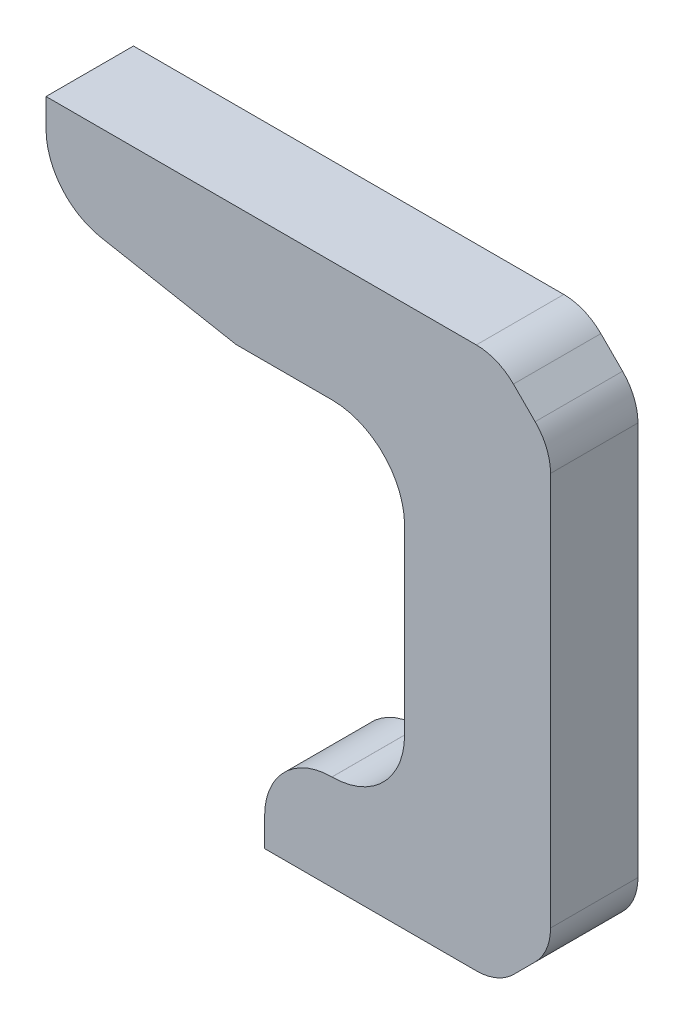
ISO-10303-21;
HEADER;
FILE_DESCRIPTION(('STEP AP214'),'2;1');
FILE_NAME('part.step','',(''),(''),'','','');
FILE_SCHEMA(('AUTOMOTIVE_DESIGN { 1 0 10303 214 1 1 1 1 }'));
ENDSEC;
DATA;
#1=APPLICATION_CONTEXT('core data for automotive mechanical design processes');
#2=APPLICATION_PROTOCOL_DEFINITION('international standard','automotive_design',2000,#1);
#3=PRODUCT_CONTEXT('',#1,'mechanical');
#4=PRODUCT('Part','Part','',(#3));
#5=PRODUCT_RELATED_PRODUCT_CATEGORY('part','',(#4));
#6=PRODUCT_DEFINITION_FORMATION('','',#4);
#7=PRODUCT_DEFINITION_CONTEXT('part definition',#1,'design');
#8=PRODUCT_DEFINITION('design','',#6,#7);
#9=PRODUCT_DEFINITION_SHAPE('','',#8);
#10=(LENGTH_UNIT() NAMED_UNIT(*) SI_UNIT(.MILLI.,.METRE.));
#11=(NAMED_UNIT(*) PLANE_ANGLE_UNIT() SI_UNIT($,.RADIAN.));
#12=(NAMED_UNIT(*) SI_UNIT($,.STERADIAN.) SOLID_ANGLE_UNIT());
#13=UNCERTAINTY_MEASURE_WITH_UNIT(LENGTH_MEASURE(1.E-05),#10,'distance_accuracy_value','');
#14=(GEOMETRIC_REPRESENTATION_CONTEXT(3) GLOBAL_UNCERTAINTY_ASSIGNED_CONTEXT((#13)) GLOBAL_UNIT_ASSIGNED_CONTEXT((#10,
#11,#12)) REPRESENTATION_CONTEXT('',''));
#15=CARTESIAN_POINT('',(0.,0.,0.));
#16=DIRECTION('',(0.,0.,1.));
#17=DIRECTION('',(1.,0.,0.));
#18=AXIS2_PLACEMENT_3D('',#15,#16,#17);
#19=CARTESIAN_POINT('',(-16.6933259094192,0.,10.));
#20=DIRECTION('',(1.,0.,0.));
#21=DIRECTION('',(0.,0.,-1.));
#22=AXIS2_PLACEMENT_3D('',#19,#20,#21);
#23=PLANE('',#22);
#24=DIRECTION('',(0.,0.,1.));
#25=VECTOR('',#24,1.);
#26=CARTESIAN_POINT('',(-16.6933259094192,21.,10.));
#27=LINE('',#26,#25);
#28=CARTESIAN_POINT('',(-16.6933259094192,21.,0.));
#29=VERTEX_POINT('',#28);
#30=CARTESIAN_POINT('',(-16.6933259094192,21.,8.));
#31=VERTEX_POINT('',#30);
#32=EDGE_CURVE('E204',#29,#31,#27,.T.);
#33=ORIENTED_EDGE('',*,*,#32,.F.);
#34=DIRECTION('',(0.,-1.,0.));
#35=VECTOR('',#34,1.);
#36=CARTESIAN_POINT('',(-16.6933259094192,0.,0.));
#37=LINE('',#36,#35);
#38=CARTESIAN_POINT('',(-16.6933259094192,19.25,0.));
#39=VERTEX_POINT('',#38);
#40=EDGE_CURVE('E215',#29,#39,#37,.T.);
#41=ORIENTED_EDGE('',*,*,#40,.T.);
#42=DIRECTION('',(0.,0.,-1.));
#43=VECTOR('',#42,1.);
#44=CARTESIAN_POINT('',(-16.6933259094192,19.25,10.));
#45=LINE('',#44,#43);
#46=CARTESIAN_POINT('',(-16.6933259094192,19.25,10.));
#47=VERTEX_POINT('',#46);
#48=EDGE_CURVE('E210',#47,#39,#45,.T.);
#49=ORIENTED_EDGE('',*,*,#48,.F.);
#50=DIRECTION('',(0.,-1.,0.));
#51=VECTOR('',#50,1.);
#52=CARTESIAN_POINT('',(-16.6933259094192,0.,10.));
#53=LINE('',#52,#51);
#54=CARTESIAN_POINT('',(-16.6933259094192,40.,10.));
#55=VERTEX_POINT('',#54);
#56=EDGE_CURVE('E274',#55,#47,#53,.T.);
#57=ORIENTED_EDGE('',*,*,#56,.F.);
#58=DIRECTION('',(0.,0.,-1.));
#59=VECTOR('',#58,1.);
#60=CARTESIAN_POINT('',(-16.6933259094192,40.,10.));
#61=LINE('',#60,#59);
#62=CARTESIAN_POINT('',(-16.6933259094192,40.,8.));
#63=VERTEX_POINT('',#62);
#64=EDGE_CURVE('E275',#55,#63,#61,.T.);
#65=ORIENTED_EDGE('',*,*,#64,.T.);
#66=DIRECTION('',(0.,-1.,0.));
#67=VECTOR('',#66,1.);
#68=CARTESIAN_POINT('',(-16.6933259094192,0.,8.));
#69=LINE('',#68,#67);
#70=EDGE_CURVE('E218',#63,#31,#69,.T.);
#71=ORIENTED_EDGE('',*,*,#70,.T.);
#72=EDGE_LOOP('',(#33,#41,#49,#57,#65,#71));
#73=FACE_BOUND('',#72,.T.);
#74=ADVANCED_FACE('F35',(#73),#23,.F.);
#75=CARTESIAN_POINT('',(-24.9933259094192,40.,10.));
#76=DIRECTION('',(0.,0.,-1.));
#77=DIRECTION('',(-1.,0.,0.));
#78=AXIS2_PLACEMENT_3D('',#75,#76,#77);
#79=CYLINDRICAL_SURFACE('',#78,8.3);
#80=CARTESIAN_POINT('',(-24.9933259094192,40.,0.));
#81=DIRECTION('',(0.,0.,1.));
#82=DIRECTION('',(1.,0.,0.));
#83=AXIS2_PLACEMENT_3D('',#80,#81,#82);
#84=CIRCLE('',#83,8.3);
#85=CARTESIAN_POINT('',(-16.7537870873733,41.,0.));
#86=VERTEX_POINT('',#85);
#87=CARTESIAN_POINT('',(-24.9933259094192,48.3,0.));
#88=VERTEX_POINT('',#87);
#89=EDGE_CURVE('E272',#86,#88,#84,.T.);
#90=ORIENTED_EDGE('',*,*,#89,.F.);
#91=DIRECTION('',(0.,0.,-1.));
#92=VECTOR('',#91,1.);
#93=CARTESIAN_POINT('',(-16.7537870873733,41.,10.));
#94=LINE('',#93,#92);
#95=CARTESIAN_POINT('',(-16.7537870873733,41.,8.));
#96=VERTEX_POINT('',#95);
#97=EDGE_CURVE('E219',#86,#96,#94,.F.);
#98=ORIENTED_EDGE('',*,*,#97,.T.);
#99=CARTESIAN_POINT('',(-24.9933259094192,40.,8.));
#100=DIRECTION('',(0.,0.,1.));
#101=DIRECTION('',(1.,0.,0.));
#102=AXIS2_PLACEMENT_3D('',#99,#100,#101);
#103=CIRCLE('',#102,8.3);
#104=EDGE_CURVE('E209',#63,#96,#103,.T.);
#105=ORIENTED_EDGE('',*,*,#104,.F.);
#106=ORIENTED_EDGE('',*,*,#64,.F.);
#107=CARTESIAN_POINT('',(-24.9933259094192,40.,10.));
#108=DIRECTION('',(0.,0.,1.));
#109=DIRECTION('',(1.,0.,0.));
#110=AXIS2_PLACEMENT_3D('',#107,#108,#109);
#111=CIRCLE('',#110,8.3);
#112=CARTESIAN_POINT('',(-24.9933259094192,48.3,10.));
#113=VERTEX_POINT('',#112);
#114=EDGE_CURVE('E231',#55,#113,#111,.T.);
#115=ORIENTED_EDGE('',*,*,#114,.T.);
#116=DIRECTION('',(0.,0.,-1.));
#117=VECTOR('',#116,1.);
#118=CARTESIAN_POINT('',(-24.9933259094192,48.3,10.));
#119=LINE('',#118,#117);
#120=EDGE_CURVE('E277',#113,#88,#119,.T.);
#121=ORIENTED_EDGE('',*,*,#120,.T.);
#122=EDGE_LOOP('',(#90,#98,#105,#106,#115,#121));
#123=FACE_BOUND('',#122,.T.);
#124=ADVANCED_FACE('F403',(#123),#79,.F.);
#125=CARTESIAN_POINT('',(0.,0.,0.));
#126=DIRECTION('',(0.,0.,1.));
#127=DIRECTION('',(1.,0.,0.));
#128=AXIS2_PLACEMENT_3D('',#125,#126,#127);
#129=PLANE('',#128);
#130=DIRECTION('',(0.,1.,0.));
#131=VECTOR('',#130,1.);
#132=CARTESIAN_POINT('',(-12.1933259094191,0.,0.));
#133=LINE('',#132,#131);
#134=CARTESIAN_POINT('',(-12.1933259094191,24.,0.));
#135=VERTEX_POINT('',#134);
#136=CARTESIAN_POINT('',(-12.1933259094191,38.,0.));
#137=VERTEX_POINT('',#136);
#138=EDGE_CURVE('E336',#135,#137,#133,.T.);
#139=ORIENTED_EDGE('',*,*,#138,.T.);
#140=CARTESIAN_POINT('',(-15.1933259094191,38.,0.));
#141=DIRECTION('',(0.,0.,1.));
#142=DIRECTION('',(1.,0.,0.));
#143=AXIS2_PLACEMENT_3D('',#140,#141,#142);
#144=CIRCLE('',#143,3.);
#145=CARTESIAN_POINT('',(-15.1933259094191,41.,0.));
#146=VERTEX_POINT('',#145);
#147=EDGE_CURVE('E11',#137,#146,#144,.T.);
#148=ORIENTED_EDGE('',*,*,#147,.T.);
#149=DIRECTION('',(-1.,0.,0.));
#150=VECTOR('',#149,1.);
#151=CARTESIAN_POINT('',(0.,41.,0.));
#152=LINE('',#151,#150);
#153=EDGE_CURVE('E344',#146,#86,#152,.T.);
#154=ORIENTED_EDGE('',*,*,#153,.T.);
#155=ORIENTED_EDGE('',*,*,#89,.T.);
#156=DIRECTION('',(1.,0.,0.));
#157=VECTOR('',#156,1.);
#158=CARTESIAN_POINT('',(0.,48.3,0.));
#159=LINE('',#158,#157);
#160=CARTESIAN_POINT('',(-35.9722540963591,48.3,0.));
#161=VERTEX_POINT('',#160);
#162=EDGE_CURVE('E269',#161,#88,#159,.T.);
#163=ORIENTED_EDGE('',*,*,#162,.F.);
#164=DIRECTION('',(0.983037643124041,-0.183403904541674,0.));
#165=VECTOR('',#164,1.);
#166=CARTESIAN_POINT('',(7.49815067102066,40.1897897531087,0.));
#167=LINE('',#166,#165);
#168=CARTESIAN_POINT('',(-51.4122100649709,51.1806101479449,0.));
#169=VERTEX_POINT('',#168);
#170=EDGE_CURVE('E267',#169,#161,#167,.T.);
#171=ORIENTED_EDGE('',*,*,#170,.F.);
#172=CARTESIAN_POINT('',(-50.,58.75,0.));
#173=DIRECTION('',(0.,0.,1.));
#174=DIRECTION('',(1.,0.,0.));
#175=AXIS2_PLACEMENT_3D('',#172,#173,#174);
#176=CIRCLE('',#175,7.69999999999999);
#177=CARTESIAN_POINT('',(-57.7,58.75,0.));
#178=VERTEX_POINT('',#177);
#179=EDGE_CURVE('E265',#178,#169,#176,.T.);
#180=ORIENTED_EDGE('',*,*,#179,.F.);
#181=DIRECTION('',(0.,-1.,0.));
#182=VECTOR('',#181,1.);
#183=CARTESIAN_POINT('',(-57.7,0.,0.));
#184=LINE('',#183,#182);
#185=CARTESIAN_POINT('',(-57.7,62.,0.));
#186=VERTEX_POINT('',#185);
#187=EDGE_CURVE('E263',#186,#178,#184,.T.);
#188=ORIENTED_EDGE('',*,*,#187,.F.);
#189=DIRECTION('',(1.,0.,0.));
#190=VECTOR('',#189,1.);
#191=CARTESIAN_POINT('',(0.,62.,0.));
#192=LINE('',#191,#190);
#193=CARTESIAN_POINT('',(-8.48528137423859,62.,0.));
#194=VERTEX_POINT('',#193);
#195=EDGE_CURVE('E260',#186,#194,#192,.T.);
#196=ORIENTED_EDGE('',*,*,#195,.T.);
#197=CARTESIAN_POINT('',(-8.48528137423857,56.,0.));
#198=DIRECTION('',(0.,0.,1.));
#199=DIRECTION('',(1.,0.,0.));
#200=AXIS2_PLACEMENT_3D('',#197,#198,#199);
#201=CIRCLE('',#200,6.);
#202=CARTESIAN_POINT('',(-4.24264068711927,60.2426406871192,0.));
#203=VERTEX_POINT('',#202);
#204=EDGE_CURVE('E257',#203,#194,#201,.T.);
#205=ORIENTED_EDGE('',*,*,#204,.F.);
#206=DIRECTION('',(-0.707106781186548,0.707106781186547,0.));
#207=VECTOR('',#206,1.);
#208=CARTESIAN_POINT('',(28.,28.,0.));
#209=LINE('',#208,#207);
#210=CARTESIAN_POINT('',(-1.75735931288074,57.7573593128807,0.));
#211=VERTEX_POINT('',#210);
#212=EDGE_CURVE('E255',#211,#203,#209,.T.);
#213=ORIENTED_EDGE('',*,*,#212,.F.);
#214=CARTESIAN_POINT('',(-6.,53.5147186257614,0.));
#215=DIRECTION('',(0.,0.,1.));
#216=DIRECTION('',(1.,0.,0.));
#217=AXIS2_PLACEMENT_3D('',#214,#215,#216);
#218=CIRCLE('',#217,6.);
#219=CARTESIAN_POINT('',(0.,53.5147186257614,0.));
#220=VERTEX_POINT('',#219);
#221=EDGE_CURVE('E252',#211,#220,#218,.F.);
#222=ORIENTED_EDGE('',*,*,#221,.T.);
#223=DIRECTION('',(0.,1.,0.));
#224=VECTOR('',#223,1.);
#225=CARTESIAN_POINT('',(0.,0.,0.));
#226=LINE('',#225,#224);
#227=CARTESIAN_POINT('',(0.,8.4852813742386,0.));
#228=VERTEX_POINT('',#227);
#229=EDGE_CURVE('E249',#228,#220,#226,.T.);
#230=ORIENTED_EDGE('',*,*,#229,.F.);
#231=CARTESIAN_POINT('',(-6.,8.48528137423857,0.));
#232=DIRECTION('',(0.,0.,1.));
#233=DIRECTION('',(1.,0.,0.));
#234=AXIS2_PLACEMENT_3D('',#231,#232,#233);
#235=CIRCLE('',#234,6.);
#236=CARTESIAN_POINT('',(-1.75735931288073,4.24264068711927,0.));
#237=VERTEX_POINT('',#236);
#238=EDGE_CURVE('E247',#237,#228,#235,.T.);
#239=ORIENTED_EDGE('',*,*,#238,.F.);
#240=DIRECTION('',(0.707106781186548,0.707106781186548,0.));
#241=VECTOR('',#240,1.);
#242=CARTESIAN_POINT('',(-3.,3.,0.));
#243=LINE('',#242,#241);
#244=CARTESIAN_POINT('',(-4.24264068711927,1.75735931288073,0.));
#245=VERTEX_POINT('',#244);
#246=EDGE_CURVE('E245',#245,#237,#243,.T.);
#247=ORIENTED_EDGE('',*,*,#246,.F.);
#248=CARTESIAN_POINT('',(-8.48528137423857,6.,0.));
#249=DIRECTION('',(0.,0.,1.));
#250=DIRECTION('',(1.,0.,0.));
#251=AXIS2_PLACEMENT_3D('',#248,#249,#250);
#252=CIRCLE('',#251,6.);
#253=CARTESIAN_POINT('',(-8.4852813742386,0.,0.));
#254=VERTEX_POINT('',#253);
#255=EDGE_CURVE('E242',#245,#254,#252,.F.);
#256=ORIENTED_EDGE('',*,*,#255,.T.);
#257=DIRECTION('',(1.,0.,0.));
#258=VECTOR('',#257,1.);
#259=CARTESIAN_POINT('',(0.,0.,0.));
#260=LINE('',#259,#258);
#261=CARTESIAN_POINT('',(-32.7,0.,0.));
#262=VERTEX_POINT('',#261);
#263=EDGE_CURVE('E239',#262,#254,#260,.T.);
#264=ORIENTED_EDGE('',*,*,#263,.F.);
#265=DIRECTION('',(0.,-1.,0.));
#266=VECTOR('',#265,1.);
#267=CARTESIAN_POINT('',(-32.7,0.,0.));
#268=LINE('',#267,#266);
#269=CARTESIAN_POINT('',(-32.7,3.25,0.));
#270=VERTEX_POINT('',#269);
#271=EDGE_CURVE('E237',#270,#262,#268,.T.);
#272=ORIENTED_EDGE('',*,*,#271,.F.);
#273=CARTESIAN_POINT('',(-25.,3.25,0.));
#274=DIRECTION('',(0.,0.,1.));
#275=DIRECTION('',(1.,0.,0.));
#276=AXIS2_PLACEMENT_3D('',#273,#274,#275);
#277=CIRCLE('',#276,7.7);
#278=CARTESIAN_POINT('',(-25.,10.95,0.));
#279=VERTEX_POINT('',#278);
#280=EDGE_CURVE('E235',#279,#270,#277,.T.);
#281=ORIENTED_EDGE('',*,*,#280,.F.);
#282=DIRECTION('',(-1.,2.59919078856519E-13,0.));
#283=VECTOR('',#282,1.);
#284=CARTESIAN_POINT('',(2.8461139134772E-12,10.9499999999935,0.));
#285=LINE('',#284,#283);
#286=CARTESIAN_POINT('',(-24.9933259094192,10.95,0.));
#287=VERTEX_POINT('',#286);
#288=EDGE_CURVE('E227',#287,#279,#285,.T.);
#289=ORIENTED_EDGE('',*,*,#288,.F.);
#290=CARTESIAN_POINT('',(-24.9933259094192,19.25,0.));
#291=DIRECTION('',(0.,0.,1.));
#292=DIRECTION('',(1.,0.,0.));
#293=AXIS2_PLACEMENT_3D('',#290,#291,#292);
#294=CIRCLE('',#293,8.3);
#295=EDGE_CURVE('E224',#39,#287,#294,.F.);
#296=ORIENTED_EDGE('',*,*,#295,.F.);
#297=ORIENTED_EDGE('',*,*,#40,.F.);
#298=DIRECTION('',(-1.,0.,0.));
#299=VECTOR('',#298,1.);
#300=CARTESIAN_POINT('',(0.,21.,0.));
#301=LINE('',#300,#299);
#302=CARTESIAN_POINT('',(-15.1933259094191,21.,0.));
#303=VERTEX_POINT('',#302);
#304=EDGE_CURVE('E200',#303,#29,#301,.T.);
#305=ORIENTED_EDGE('',*,*,#304,.F.);
#306=CARTESIAN_POINT('',(-15.1933259094191,24.,0.));
#307=DIRECTION('',(0.,0.,1.));
#308=DIRECTION('',(1.,0.,0.));
#309=AXIS2_PLACEMENT_3D('',#306,#307,#308);
#310=CIRCLE('',#309,3.);
#311=EDGE_CURVE('E43',#303,#135,#310,.T.);
#312=ORIENTED_EDGE('',*,*,#311,.T.);
#313=EDGE_LOOP('',(#139,#148,#154,#155,#163,#171,#180,#188,#196,#205,#213,#222,#230,#239,#247,
#256,#264,#272,#281,#289,#296,#297,#305,#312));
#314=FACE_BOUND('',#313,.T.);
#315=ADVANCED_FACE('F222',(#314),#129,.F.);
#316=CARTESIAN_POINT('',(-24.9933259094192,19.25,10.));
#317=DIRECTION('',(0.,0.,-1.));
#318=DIRECTION('',(-1.,0.,0.));
#319=AXIS2_PLACEMENT_3D('',#316,#317,#318);
#320=CYLINDRICAL_SURFACE('',#319,8.3);
#321=ORIENTED_EDGE('',*,*,#295,.T.);
#322=DIRECTION('',(0.,0.,-1.));
#323=VECTOR('',#322,1.);
#324=CARTESIAN_POINT('',(-24.9933259094192,10.95,10.));
#325=LINE('',#324,#323);
#326=CARTESIAN_POINT('',(-24.9933259094192,10.95,10.));
#327=VERTEX_POINT('',#326);
#328=EDGE_CURVE('E319',#327,#287,#325,.T.);
#329=ORIENTED_EDGE('',*,*,#328,.F.);
#330=CARTESIAN_POINT('',(-24.9933259094192,19.25,10.));
#331=DIRECTION('',(0.,0.,1.));
#332=DIRECTION('',(1.,0.,0.));
#333=AXIS2_PLACEMENT_3D('',#330,#331,#332);
#334=CIRCLE('',#333,8.3);
#335=EDGE_CURVE('E361',#47,#327,#334,.F.);
#336=ORIENTED_EDGE('',*,*,#335,.F.);
#337=ORIENTED_EDGE('',*,*,#48,.T.);
#338=EDGE_LOOP('',(#321,#329,#336,#337));
#339=FACE_BOUND('',#338,.T.);
#340=ADVANCED_FACE('F409',(#339),#320,.F.);
#341=CARTESIAN_POINT('',(2.8461139134772E-12,10.9499999999935,10.));
#342=DIRECTION('',(-2.59919078856519E-13,-1.,0.));
#343=DIRECTION('',(1.,-2.59919078856519E-13,0.));
#344=AXIS2_PLACEMENT_3D('',#341,#342,#343);
#345=PLANE('',#344);
#346=ORIENTED_EDGE('',*,*,#288,.T.);
#347=DIRECTION('',(0.,0.,-1.));
#348=VECTOR('',#347,1.);
#349=CARTESIAN_POINT('',(-25.,10.95,10.));
#350=LINE('',#349,#348);
#351=CARTESIAN_POINT('',(-25.,10.95,10.));
#352=VERTEX_POINT('',#351);
#353=EDGE_CURVE('E316',#352,#279,#350,.T.);
#354=ORIENTED_EDGE('',*,*,#353,.F.);
#355=DIRECTION('',(-1.,2.59919078856519E-13,0.));
#356=VECTOR('',#355,1.);
#357=CARTESIAN_POINT('',(2.8461139134772E-12,10.9499999999935,10.));
#358=LINE('',#357,#356);
#359=EDGE_CURVE('E363',#327,#352,#358,.T.);
#360=ORIENTED_EDGE('',*,*,#359,.F.);
#361=ORIENTED_EDGE('',*,*,#328,.T.);
#362=EDGE_LOOP('',(#346,#354,#360,#361));
#363=FACE_BOUND('',#362,.T.);
#364=ADVANCED_FACE('F413',(#363),#345,.F.);
#365=CARTESIAN_POINT('',(-25.,3.25,10.));
#366=DIRECTION('',(0.,0.,-1.));
#367=DIRECTION('',(-1.,0.,0.));
#368=AXIS2_PLACEMENT_3D('',#365,#366,#367);
#369=CYLINDRICAL_SURFACE('',#368,7.7);
#370=ORIENTED_EDGE('',*,*,#280,.T.);
#371=DIRECTION('',(0.,0.,-1.));
#372=VECTOR('',#371,1.);
#373=CARTESIAN_POINT('',(-32.7,3.25,10.));
#374=LINE('',#373,#372);
#375=CARTESIAN_POINT('',(-32.7,3.25,10.));
#376=VERTEX_POINT('',#375);
#377=EDGE_CURVE('E313',#376,#270,#374,.T.);
#378=ORIENTED_EDGE('',*,*,#377,.F.);
#379=CARTESIAN_POINT('',(-25.,3.25,10.));
#380=DIRECTION('',(0.,0.,1.));
#381=DIRECTION('',(1.,0.,0.));
#382=AXIS2_PLACEMENT_3D('',#379,#380,#381);
#383=CIRCLE('',#382,7.7);
#384=EDGE_CURVE('E365',#352,#376,#383,.T.);
#385=ORIENTED_EDGE('',*,*,#384,.F.);
#386=ORIENTED_EDGE('',*,*,#353,.T.);
#387=EDGE_LOOP('',(#370,#378,#385,#386));
#388=FACE_BOUND('',#387,.T.);
#389=ADVANCED_FACE('F419',(#388),#369,.T.);
#390=CARTESIAN_POINT('',(-32.7,0.,10.));
#391=DIRECTION('',(1.,0.,0.));
#392=DIRECTION('',(0.,0.,-1.));
#393=AXIS2_PLACEMENT_3D('',#390,#391,#392);
#394=PLANE('',#393);
#395=ORIENTED_EDGE('',*,*,#271,.T.);
#396=DIRECTION('',(0.,0.,-1.));
#397=VECTOR('',#396,1.);
#398=CARTESIAN_POINT('',(-32.7,0.,10.));
#399=LINE('',#398,#397);
#400=CARTESIAN_POINT('',(-32.7,0.,10.));
#401=VERTEX_POINT('',#400);
#402=EDGE_CURVE('E310',#401,#262,#399,.T.);
#403=ORIENTED_EDGE('',*,*,#402,.F.);
#404=DIRECTION('',(0.,-1.,0.));
#405=VECTOR('',#404,1.);
#406=CARTESIAN_POINT('',(-32.7,0.,10.));
#407=LINE('',#406,#405);
#408=EDGE_CURVE('E367',#376,#401,#407,.T.);
#409=ORIENTED_EDGE('',*,*,#408,.F.);
#410=ORIENTED_EDGE('',*,*,#377,.T.);
#411=EDGE_LOOP('',(#395,#403,#409,#410));
#412=FACE_BOUND('',#411,.T.);
#413=ADVANCED_FACE('F423',(#412),#394,.F.);
#414=CARTESIAN_POINT('',(0.,0.,10.));
#415=DIRECTION('',(0.,1.,0.));
#416=DIRECTION('',(0.,0.,1.));
#417=AXIS2_PLACEMENT_3D('',#414,#415,#416);
#418=PLANE('',#417);
#419=ORIENTED_EDGE('',*,*,#263,.T.);
#420=DIRECTION('',(0.,0.,-1.));
#421=VECTOR('',#420,1.);
#422=CARTESIAN_POINT('',(-8.4852813742386,0.,10.));
#423=LINE('',#422,#421);
#424=CARTESIAN_POINT('',(-8.4852813742386,0.,10.));
#425=VERTEX_POINT('',#424);
#426=EDGE_CURVE('E308',#425,#254,#423,.T.);
#427=ORIENTED_EDGE('',*,*,#426,.F.);
#428=DIRECTION('',(1.,0.,0.));
#429=VECTOR('',#428,1.);
#430=CARTESIAN_POINT('',(0.,0.,10.));
#431=LINE('',#430,#429);
#432=EDGE_CURVE('E369',#401,#425,#431,.T.);
#433=ORIENTED_EDGE('',*,*,#432,.F.);
#434=ORIENTED_EDGE('',*,*,#402,.T.);
#435=EDGE_LOOP('',(#419,#427,#433,#434));
#436=FACE_BOUND('',#435,.T.);
#437=ADVANCED_FACE('F428',(#436),#418,.F.);
#438=CARTESIAN_POINT('',(-8.48528137423857,6.,10.));
#439=DIRECTION('',(0.,0.,-1.));
#440=DIRECTION('',(-1.,0.,0.));
#441=AXIS2_PLACEMENT_3D('',#438,#439,#440);
#442=CYLINDRICAL_SURFACE('',#441,6.);
#443=ORIENTED_EDGE('',*,*,#255,.F.);
#444=DIRECTION('',(0.,0.,-1.));
#445=VECTOR('',#444,1.);
#446=CARTESIAN_POINT('',(-4.24264068711927,1.75735931288073,10.));
#447=LINE('',#446,#445);
#448=CARTESIAN_POINT('',(-4.24264068711927,1.75735931288073,10.));
#449=VERTEX_POINT('',#448);
#450=EDGE_CURVE('E306',#449,#245,#447,.T.);
#451=ORIENTED_EDGE('',*,*,#450,.F.);
#452=CARTESIAN_POINT('',(-8.48528137423857,6.,10.));
#453=DIRECTION('',(0.,0.,1.));
#454=DIRECTION('',(1.,0.,0.));
#455=AXIS2_PLACEMENT_3D('',#452,#453,#454);
#456=CIRCLE('',#455,6.);
#457=EDGE_CURVE('E371',#449,#425,#456,.F.);
#458=ORIENTED_EDGE('',*,*,#457,.T.);
#459=ORIENTED_EDGE('',*,*,#426,.T.);
#460=EDGE_LOOP('',(#443,#451,#458,#459));
#461=FACE_BOUND('',#460,.T.);
#462=ADVANCED_FACE('F434',(#461),#442,.T.);
#463=CARTESIAN_POINT('',(-3.,3.,10.));
#464=DIRECTION('',(-0.707106781186548,0.707106781186548,0.));
#465=DIRECTION('',(-0.707106781186548,-0.707106781186548,0.));
#466=AXIS2_PLACEMENT_3D('',#463,#464,#465);
#467=PLANE('',#466);
#468=ORIENTED_EDGE('',*,*,#246,.T.);
#469=DIRECTION('',(0.,0.,-1.));
#470=VECTOR('',#469,1.);
#471=CARTESIAN_POINT('',(-1.75735931288073,4.24264068711927,10.));
#472=LINE('',#471,#470);
#473=CARTESIAN_POINT('',(-1.75735931288073,4.24264068711927,10.));
#474=VERTEX_POINT('',#473);
#475=EDGE_CURVE('E303',#474,#237,#472,.T.);
#476=ORIENTED_EDGE('',*,*,#475,.F.);
#477=DIRECTION('',(0.707106781186548,0.707106781186548,0.));
#478=VECTOR('',#477,1.);
#479=CARTESIAN_POINT('',(-3.,3.,10.));
#480=LINE('',#479,#478);
#481=EDGE_CURVE('E374',#449,#474,#480,.T.);
#482=ORIENTED_EDGE('',*,*,#481,.F.);
#483=ORIENTED_EDGE('',*,*,#450,.T.);
#484=EDGE_LOOP('',(#468,#476,#482,#483));
#485=FACE_BOUND('',#484,.T.);
#486=ADVANCED_FACE('F437',(#485),#467,.F.);
#487=CARTESIAN_POINT('',(-6.,8.48528137423857,10.));
#488=DIRECTION('',(0.,0.,-1.));
#489=DIRECTION('',(-1.,0.,0.));
#490=AXIS2_PLACEMENT_3D('',#487,#488,#489);
#491=CYLINDRICAL_SURFACE('',#490,6.);
#492=ORIENTED_EDGE('',*,*,#238,.T.);
#493=DIRECTION('',(0.,0.,-1.));
#494=VECTOR('',#493,1.);
#495=CARTESIAN_POINT('',(0.,8.4852813742386,10.));
#496=LINE('',#495,#494);
#497=CARTESIAN_POINT('',(0.,8.4852813742386,10.));
#498=VERTEX_POINT('',#497);
#499=EDGE_CURVE('E300',#498,#228,#496,.T.);
#500=ORIENTED_EDGE('',*,*,#499,.F.);
#501=CARTESIAN_POINT('',(-6.,8.48528137423857,10.));
#502=DIRECTION('',(0.,0.,1.));
#503=DIRECTION('',(1.,0.,0.));
#504=AXIS2_PLACEMENT_3D('',#501,#502,#503);
#505=CIRCLE('',#504,6.);
#506=EDGE_CURVE('E376',#474,#498,#505,.T.);
#507=ORIENTED_EDGE('',*,*,#506,.F.);
#508=ORIENTED_EDGE('',*,*,#475,.T.);
#509=EDGE_LOOP('',(#492,#500,#507,#508));
#510=FACE_BOUND('',#509,.T.);
#511=ADVANCED_FACE('F442',(#510),#491,.T.);
#512=CARTESIAN_POINT('',(0.,0.,10.));
#513=DIRECTION('',(-1.,0.,0.));
#514=DIRECTION('',(0.,0.,1.));
#515=AXIS2_PLACEMENT_3D('',#512,#513,#514);
#516=PLANE('',#515);
#517=ORIENTED_EDGE('',*,*,#229,.T.);
#518=DIRECTION('',(0.,0.,-1.));
#519=VECTOR('',#518,1.);
#520=CARTESIAN_POINT('',(0.,53.5147186257614,10.));
#521=LINE('',#520,#519);
#522=CARTESIAN_POINT('',(0.,53.5147186257614,10.));
#523=VERTEX_POINT('',#522);
#524=EDGE_CURVE('E298',#523,#220,#521,.T.);
#525=ORIENTED_EDGE('',*,*,#524,.F.);
#526=DIRECTION('',(0.,1.,0.));
#527=VECTOR('',#526,1.);
#528=CARTESIAN_POINT('',(0.,0.,10.));
#529=LINE('',#528,#527);
#530=EDGE_CURVE('E378',#498,#523,#529,.T.);
#531=ORIENTED_EDGE('',*,*,#530,.F.);
#532=ORIENTED_EDGE('',*,*,#499,.T.);
#533=EDGE_LOOP('',(#517,#525,#531,#532));
#534=FACE_BOUND('',#533,.T.);
#535=ADVANCED_FACE('F447',(#534),#516,.F.);
#536=CARTESIAN_POINT('',(-6.,53.5147186257614,10.));
#537=DIRECTION('',(0.,0.,-1.));
#538=DIRECTION('',(-1.,0.,0.));
#539=AXIS2_PLACEMENT_3D('',#536,#537,#538);
#540=CYLINDRICAL_SURFACE('',#539,6.);
#541=ORIENTED_EDGE('',*,*,#221,.F.);
#542=DIRECTION('',(0.,0.,-1.));
#543=VECTOR('',#542,1.);
#544=CARTESIAN_POINT('',(-1.75735931288074,57.7573593128807,10.));
#545=LINE('',#544,#543);
#546=CARTESIAN_POINT('',(-1.75735931288074,57.7573593128807,10.));
#547=VERTEX_POINT('',#546);
#548=EDGE_CURVE('E296',#547,#211,#545,.T.);
#549=ORIENTED_EDGE('',*,*,#548,.F.);
#550=CARTESIAN_POINT('',(-6.,53.5147186257614,10.));
#551=DIRECTION('',(0.,0.,1.));
#552=DIRECTION('',(1.,0.,0.));
#553=AXIS2_PLACEMENT_3D('',#550,#551,#552);
#554=CIRCLE('',#553,6.);
#555=EDGE_CURVE('E380',#547,#523,#554,.F.);
#556=ORIENTED_EDGE('',*,*,#555,.T.);
#557=ORIENTED_EDGE('',*,*,#524,.T.);
#558=EDGE_LOOP('',(#541,#549,#556,#557));
#559=FACE_BOUND('',#558,.T.);
#560=ADVANCED_FACE('F451',(#559),#540,.T.);
#561=CARTESIAN_POINT('',(28.,28.,10.));
#562=DIRECTION('',(-0.707106781186547,-0.707106781186548,0.));
#563=DIRECTION('',(0.707106781186548,-0.707106781186547,0.));
#564=AXIS2_PLACEMENT_3D('',#561,#562,#563);
#565=PLANE('',#564);
#566=ORIENTED_EDGE('',*,*,#212,.T.);
#567=DIRECTION('',(0.,0.,-1.));
#568=VECTOR('',#567,1.);
#569=CARTESIAN_POINT('',(-4.24264068711927,60.2426406871192,10.));
#570=LINE('',#569,#568);
#571=CARTESIAN_POINT('',(-4.24264068711927,60.2426406871192,10.));
#572=VERTEX_POINT('',#571);
#573=EDGE_CURVE('E293',#572,#203,#570,.T.);
#574=ORIENTED_EDGE('',*,*,#573,.F.);
#575=DIRECTION('',(-0.707106781186548,0.707106781186547,0.));
#576=VECTOR('',#575,1.);
#577=CARTESIAN_POINT('',(28.,28.,10.));
#578=LINE('',#577,#576);
#579=EDGE_CURVE('E383',#547,#572,#578,.T.);
#580=ORIENTED_EDGE('',*,*,#579,.F.);
#581=ORIENTED_EDGE('',*,*,#548,.T.);
#582=EDGE_LOOP('',(#566,#574,#580,#581));
#583=FACE_BOUND('',#582,.T.);
#584=ADVANCED_FACE('F456',(#583),#565,.F.);
#585=CARTESIAN_POINT('',(-8.48528137423857,56.,10.));
#586=DIRECTION('',(0.,0.,-1.));
#587=DIRECTION('',(-1.,0.,0.));
#588=AXIS2_PLACEMENT_3D('',#585,#586,#587);
#589=CYLINDRICAL_SURFACE('',#588,6.);
#590=ORIENTED_EDGE('',*,*,#204,.T.);
#591=DIRECTION('',(0.,0.,-1.));
#592=VECTOR('',#591,1.);
#593=CARTESIAN_POINT('',(-8.48528137423859,62.,10.));
#594=LINE('',#593,#592);
#595=CARTESIAN_POINT('',(-8.48528137423859,62.,10.));
#596=VERTEX_POINT('',#595);
#597=EDGE_CURVE('E291',#596,#194,#594,.T.);
#598=ORIENTED_EDGE('',*,*,#597,.F.);
#599=CARTESIAN_POINT('',(-8.48528137423857,56.,10.));
#600=DIRECTION('',(0.,0.,1.));
#601=DIRECTION('',(1.,0.,0.));
#602=AXIS2_PLACEMENT_3D('',#599,#600,#601);
#603=CIRCLE('',#602,6.);
#604=EDGE_CURVE('E385',#572,#596,#603,.T.);
#605=ORIENTED_EDGE('',*,*,#604,.F.);
#606=ORIENTED_EDGE('',*,*,#573,.T.);
#607=EDGE_LOOP('',(#590,#598,#605,#606));
#608=FACE_BOUND('',#607,.T.);
#609=ADVANCED_FACE('F461',(#608),#589,.T.);
#610=CARTESIAN_POINT('',(0.,62.,10.));
#611=DIRECTION('',(0.,1.,0.));
#612=DIRECTION('',(-1.,0.,0.));
#613=AXIS2_PLACEMENT_3D('',#610,#611,#612);
#614=PLANE('',#613);
#615=ORIENTED_EDGE('',*,*,#195,.F.);
#616=DIRECTION('',(0.,0.,-1.));
#617=VECTOR('',#616,1.);
#618=CARTESIAN_POINT('',(-57.7,62.,10.));
#619=LINE('',#618,#617);
#620=CARTESIAN_POINT('',(-57.7,62.,10.));
#621=VERTEX_POINT('',#620);
#622=EDGE_CURVE('E289',#621,#186,#619,.T.);
#623=ORIENTED_EDGE('',*,*,#622,.F.);
#624=DIRECTION('',(1.,0.,0.));
#625=VECTOR('',#624,1.);
#626=CARTESIAN_POINT('',(0.,62.,10.));
#627=LINE('',#626,#625);
#628=EDGE_CURVE('E387',#621,#596,#627,.T.);
#629=ORIENTED_EDGE('',*,*,#628,.T.);
#630=ORIENTED_EDGE('',*,*,#597,.T.);
#631=EDGE_LOOP('',(#615,#623,#629,#630));
#632=FACE_BOUND('',#631,.T.);
#633=ADVANCED_FACE('F465',(#632),#614,.T.);
#634=CARTESIAN_POINT('',(-57.7,0.,10.));
#635=DIRECTION('',(1.,0.,0.));
#636=DIRECTION('',(0.,0.,-1.));
#637=AXIS2_PLACEMENT_3D('',#634,#635,#636);
#638=PLANE('',#637);
#639=ORIENTED_EDGE('',*,*,#187,.T.);
#640=DIRECTION('',(0.,0.,-1.));
#641=VECTOR('',#640,1.);
#642=CARTESIAN_POINT('',(-57.7,58.75,10.));
#643=LINE('',#642,#641);
#644=CARTESIAN_POINT('',(-57.7,58.75,10.));
#645=VERTEX_POINT('',#644);
#646=EDGE_CURVE('E286',#645,#178,#643,.T.);
#647=ORIENTED_EDGE('',*,*,#646,.F.);
#648=DIRECTION('',(0.,-1.,0.));
#649=VECTOR('',#648,1.);
#650=CARTESIAN_POINT('',(-57.7,0.,10.));
#651=LINE('',#650,#649);
#652=EDGE_CURVE('E390',#621,#645,#651,.T.);
#653=ORIENTED_EDGE('',*,*,#652,.F.);
#654=ORIENTED_EDGE('',*,*,#622,.T.);
#655=EDGE_LOOP('',(#639,#647,#653,#654));
#656=FACE_BOUND('',#655,.T.);
#657=ADVANCED_FACE('F470',(#656),#638,.F.);
#658=CARTESIAN_POINT('',(-50.,58.75,10.));
#659=DIRECTION('',(0.,0.,-1.));
#660=DIRECTION('',(-1.,0.,0.));
#661=AXIS2_PLACEMENT_3D('',#658,#659,#660);
#662=CYLINDRICAL_SURFACE('',#661,7.69999999999999);
#663=ORIENTED_EDGE('',*,*,#179,.T.);
#664=DIRECTION('',(0.,0.,-1.));
#665=VECTOR('',#664,1.);
#666=CARTESIAN_POINT('',(-51.4122100649709,51.1806101479449,10.));
#667=LINE('',#666,#665);
#668=CARTESIAN_POINT('',(-51.4122100649709,51.1806101479449,10.));
#669=VERTEX_POINT('',#668);
#670=EDGE_CURVE('E283',#669,#169,#667,.T.);
#671=ORIENTED_EDGE('',*,*,#670,.F.);
#672=CARTESIAN_POINT('',(-50.,58.75,10.));
#673=DIRECTION('',(0.,0.,1.));
#674=DIRECTION('',(1.,0.,0.));
#675=AXIS2_PLACEMENT_3D('',#672,#673,#674);
#676=CIRCLE('',#675,7.69999999999999);
#677=EDGE_CURVE('E392',#645,#669,#676,.T.);
#678=ORIENTED_EDGE('',*,*,#677,.F.);
#679=ORIENTED_EDGE('',*,*,#646,.T.);
#680=EDGE_LOOP('',(#663,#671,#678,#679));
#681=FACE_BOUND('',#680,.T.);
#682=ADVANCED_FACE('F476',(#681),#662,.T.);
#683=CARTESIAN_POINT('',(7.49815067102066,40.1897897531087,10.));
#684=DIRECTION('',(0.183403904541674,0.983037643124041,0.));
#685=DIRECTION('',(-0.983037643124041,0.183403904541674,0.));
#686=AXIS2_PLACEMENT_3D('',#683,#684,#685);
#687=PLANE('',#686);
#688=ORIENTED_EDGE('',*,*,#170,.T.);
#689=DIRECTION('',(0.,0.,-1.));
#690=VECTOR('',#689,1.);
#691=CARTESIAN_POINT('',(-35.9722540963591,48.3,10.));
#692=LINE('',#691,#690);
#693=CARTESIAN_POINT('',(-35.9722540963591,48.3,10.));
#694=VERTEX_POINT('',#693);
#695=EDGE_CURVE('E280',#694,#161,#692,.T.);
#696=ORIENTED_EDGE('',*,*,#695,.F.);
#697=DIRECTION('',(0.983037643124041,-0.183403904541674,0.));
#698=VECTOR('',#697,1.);
#699=CARTESIAN_POINT('',(7.49815067102066,40.1897897531087,10.));
#700=LINE('',#699,#698);
#701=EDGE_CURVE('E394',#669,#694,#700,.T.);
#702=ORIENTED_EDGE('',*,*,#701,.F.);
#703=ORIENTED_EDGE('',*,*,#670,.T.);
#704=EDGE_LOOP('',(#688,#696,#702,#703));
#705=FACE_BOUND('',#704,.T.);
#706=ADVANCED_FACE('F480',(#705),#687,.F.);
#707=CARTESIAN_POINT('',(0.,48.3,10.));
#708=DIRECTION('',(0.,1.,0.));
#709=DIRECTION('',(0.,0.,1.));
#710=AXIS2_PLACEMENT_3D('',#707,#708,#709);
#711=PLANE('',#710);
#712=ORIENTED_EDGE('',*,*,#162,.T.);
#713=ORIENTED_EDGE('',*,*,#120,.F.);
#714=DIRECTION('',(1.,0.,0.));
#715=VECTOR('',#714,1.);
#716=CARTESIAN_POINT('',(0.,48.3,10.));
#717=LINE('',#716,#715);
#718=EDGE_CURVE('E395',#694,#113,#717,.T.);
#719=ORIENTED_EDGE('',*,*,#718,.F.);
#720=ORIENTED_EDGE('',*,*,#695,.T.);
#721=EDGE_LOOP('',(#712,#713,#719,#720));
#722=FACE_BOUND('',#721,.T.);
#723=ADVANCED_FACE('F483',(#722),#711,.F.);
#724=CARTESIAN_POINT('',(0.,0.,10.));
#725=DIRECTION('',(0.,0.,1.));
#726=DIRECTION('',(1.,0.,0.));
#727=AXIS2_PLACEMENT_3D('',#724,#725,#726);
#728=PLANE('',#727);
#729=ORIENTED_EDGE('',*,*,#56,.T.);
#730=ORIENTED_EDGE('',*,*,#335,.T.);
#731=ORIENTED_EDGE('',*,*,#359,.T.);
#732=ORIENTED_EDGE('',*,*,#384,.T.);
#733=ORIENTED_EDGE('',*,*,#408,.T.);
#734=ORIENTED_EDGE('',*,*,#432,.T.);
#735=ORIENTED_EDGE('',*,*,#457,.F.);
#736=ORIENTED_EDGE('',*,*,#481,.T.);
#737=ORIENTED_EDGE('',*,*,#506,.T.);
#738=ORIENTED_EDGE('',*,*,#530,.T.);
#739=ORIENTED_EDGE('',*,*,#555,.F.);
#740=ORIENTED_EDGE('',*,*,#579,.T.);
#741=ORIENTED_EDGE('',*,*,#604,.T.);
#742=ORIENTED_EDGE('',*,*,#628,.F.);
#743=ORIENTED_EDGE('',*,*,#652,.T.);
#744=ORIENTED_EDGE('',*,*,#677,.T.);
#745=ORIENTED_EDGE('',*,*,#701,.T.);
#746=ORIENTED_EDGE('',*,*,#718,.T.);
#747=ORIENTED_EDGE('',*,*,#114,.F.);
#748=EDGE_LOOP('',(#729,#730,#731,#732,#733,#734,#735,#736,#737,#738,#739,#740,#741,#742,#743,
#744,#745,#746,#747));
#749=FACE_BOUND('',#748,.T.);
#750=ADVANCED_FACE('F406',(#749),#728,.T.);
#751=CARTESIAN_POINT('',(0.,0.,8.));
#752=DIRECTION('',(0.,0.,1.));
#753=DIRECTION('',(1.,0.,0.));
#754=AXIS2_PLACEMENT_3D('',#751,#752,#753);
#755=PLANE('',#754);
#756=DIRECTION('',(0.,1.,0.));
#757=VECTOR('',#756,1.);
#758=CARTESIAN_POINT('',(-12.1933259094191,0.,8.));
#759=LINE('',#758,#757);
#760=CARTESIAN_POINT('',(-12.1933259094191,24.,8.));
#761=VERTEX_POINT('',#760);
#762=CARTESIAN_POINT('',(-12.1933259094191,38.,8.));
#763=VERTEX_POINT('',#762);
#764=EDGE_CURVE('E351',#761,#763,#759,.T.);
#765=ORIENTED_EDGE('',*,*,#764,.F.);
#766=CARTESIAN_POINT('',(-15.1933259094191,24.,8.));
#767=DIRECTION('',(0.,0.,1.));
#768=DIRECTION('',(1.,0.,0.));
#769=AXIS2_PLACEMENT_3D('',#766,#767,#768);
#770=CIRCLE('',#769,3.);
#771=CARTESIAN_POINT('',(-15.1933259094191,21.,8.));
#772=VERTEX_POINT('',#771);
#773=EDGE_CURVE('E333',#761,#772,#770,.F.);
#774=ORIENTED_EDGE('',*,*,#773,.T.);
#775=DIRECTION('',(1.,0.,0.));
#776=VECTOR('',#775,1.);
#777=CARTESIAN_POINT('',(0.,21.,8.));
#778=LINE('',#777,#776);
#779=EDGE_CURVE('E350',#31,#772,#778,.T.);
#780=ORIENTED_EDGE('',*,*,#779,.F.);
#781=ORIENTED_EDGE('',*,*,#70,.F.);
#782=ORIENTED_EDGE('',*,*,#104,.T.);
#783=DIRECTION('',(-1.,0.,0.));
#784=VECTOR('',#783,1.);
#785=CARTESIAN_POINT('',(0.,41.,8.));
#786=LINE('',#785,#784);
#787=CARTESIAN_POINT('',(-15.1933259094191,41.,8.));
#788=VERTEX_POINT('',#787);
#789=EDGE_CURVE('E220',#788,#96,#786,.T.);
#790=ORIENTED_EDGE('',*,*,#789,.F.);
#791=CARTESIAN_POINT('',(-15.1933259094191,38.,8.));
#792=DIRECTION('',(0.,0.,1.));
#793=DIRECTION('',(1.,0.,0.));
#794=AXIS2_PLACEMENT_3D('',#791,#792,#793);
#795=CIRCLE('',#794,3.);
#796=EDGE_CURVE('E331',#788,#763,#795,.F.);
#797=ORIENTED_EDGE('',*,*,#796,.T.);
#798=EDGE_LOOP('',(#765,#774,#780,#781,#782,#790,#797));
#799=FACE_BOUND('',#798,.T.);
#800=ADVANCED_FACE('F349',(#799),#755,.F.);
#801=CARTESIAN_POINT('',(0.,21.,8.));
#802=DIRECTION('',(0.,1.,0.));
#803=DIRECTION('',(0.,0.,1.));
#804=AXIS2_PLACEMENT_3D('',#801,#802,#803);
#805=PLANE('',#804);
#806=ORIENTED_EDGE('',*,*,#779,.T.);
#807=DIRECTION('',(0.,0.,-1.));
#808=VECTOR('',#807,1.);
#809=CARTESIAN_POINT('',(-15.1933259094191,21.,0.));
#810=LINE('',#809,#808);
#811=EDGE_CURVE('E207',#772,#303,#810,.T.);
#812=ORIENTED_EDGE('',*,*,#811,.T.);
#813=ORIENTED_EDGE('',*,*,#304,.T.);
#814=ORIENTED_EDGE('',*,*,#32,.T.);
#815=EDGE_LOOP('',(#806,#812,#813,#814));
#816=FACE_BOUND('',#815,.T.);
#817=ADVANCED_FACE('F203',(#816),#805,.T.);
#818=CARTESIAN_POINT('',(-12.1933259094191,0.,8.));
#819=DIRECTION('',(-1.,0.,0.));
#820=DIRECTION('',(0.,0.,1.));
#821=AXIS2_PLACEMENT_3D('',#818,#819,#820);
#822=PLANE('',#821);
#823=ORIENTED_EDGE('',*,*,#138,.F.);
#824=DIRECTION('',(0.,0.,-1.));
#825=VECTOR('',#824,1.);
#826=CARTESIAN_POINT('',(-12.1933259094191,24.,8.));
#827=LINE('',#826,#825);
#828=EDGE_CURVE('E329',#135,#761,#827,.F.);
#829=ORIENTED_EDGE('',*,*,#828,.T.);
#830=ORIENTED_EDGE('',*,*,#764,.T.);
#831=DIRECTION('',(0.,0.,-1.));
#832=VECTOR('',#831,1.);
#833=CARTESIAN_POINT('',(-12.1933259094191,38.,0.));
#834=LINE('',#833,#832);
#835=EDGE_CURVE('E326',#763,#137,#834,.T.);
#836=ORIENTED_EDGE('',*,*,#835,.T.);
#837=EDGE_LOOP('',(#823,#829,#830,#836));
#838=FACE_BOUND('',#837,.T.);
#839=ADVANCED_FACE('F340',(#838),#822,.T.);
#840=CARTESIAN_POINT('',(0.,41.,8.));
#841=DIRECTION('',(0.,-1.,0.));
#842=DIRECTION('',(0.,0.,-1.));
#843=AXIS2_PLACEMENT_3D('',#840,#841,#842);
#844=PLANE('',#843);
#845=ORIENTED_EDGE('',*,*,#153,.F.);
#846=DIRECTION('',(0.,0.,-1.));
#847=VECTOR('',#846,1.);
#848=CARTESIAN_POINT('',(-15.1933259094191,41.,8.));
#849=LINE('',#848,#847);
#850=EDGE_CURVE('E55',#146,#788,#849,.F.);
#851=ORIENTED_EDGE('',*,*,#850,.T.);
#852=ORIENTED_EDGE('',*,*,#789,.T.);
#853=ORIENTED_EDGE('',*,*,#97,.F.);
#854=EDGE_LOOP('',(#845,#851,#852,#853));
#855=FACE_BOUND('',#854,.T.);
#856=ADVANCED_FACE('F485',(#855),#844,.T.);
#857=CARTESIAN_POINT('',(-15.1933259094191,24.,8.));
#858=DIRECTION('',(0.,0.,1.));
#859=DIRECTION('',(1.,0.,0.));
#860=AXIS2_PLACEMENT_3D('',#857,#858,#859);
#861=CYLINDRICAL_SURFACE('',#860,3.);
#862=ORIENTED_EDGE('',*,*,#773,.F.);
#863=ORIENTED_EDGE('',*,*,#828,.F.);
#864=ORIENTED_EDGE('',*,*,#311,.F.);
#865=ORIENTED_EDGE('',*,*,#811,.F.);
#866=EDGE_LOOP('',(#862,#863,#864,#865));
#867=FACE_BOUND('',#866,.T.);
#868=ADVANCED_FACE('F347',(#867),#861,.F.);
#869=CARTESIAN_POINT('',(-15.1933259094191,38.,8.));
#870=DIRECTION('',(0.,0.,1.));
#871=DIRECTION('',(1.,0.,0.));
#872=AXIS2_PLACEMENT_3D('',#869,#870,#871);
#873=CYLINDRICAL_SURFACE('',#872,3.);
#874=ORIENTED_EDGE('',*,*,#796,.F.);
#875=ORIENTED_EDGE('',*,*,#850,.F.);
#876=ORIENTED_EDGE('',*,*,#147,.F.);
#877=ORIENTED_EDGE('',*,*,#835,.F.);
#878=EDGE_LOOP('',(#874,#875,#876,#877));
#879=FACE_BOUND('',#878,.T.);
#880=ADVANCED_FACE('F37',(#879),#873,.F.);
#881=CLOSED_SHELL('',(#74,#124,#315,#340,#364,#389,#413,#437,#462,#486,#511,#535,#560,#584,#609,
#633,#657,#682,#706,#723,#750,#800,#817,#839,#856,#868,#880));
#882=MANIFOLD_SOLID_BREP('B2',#881);
#883=ADVANCED_BREP_SHAPE_REPRESENTATION('',(#18,#882),#14);
#884=SHAPE_DEFINITION_REPRESENTATION(#9,#883);
ENDSEC;
END-ISO-10303-21;
